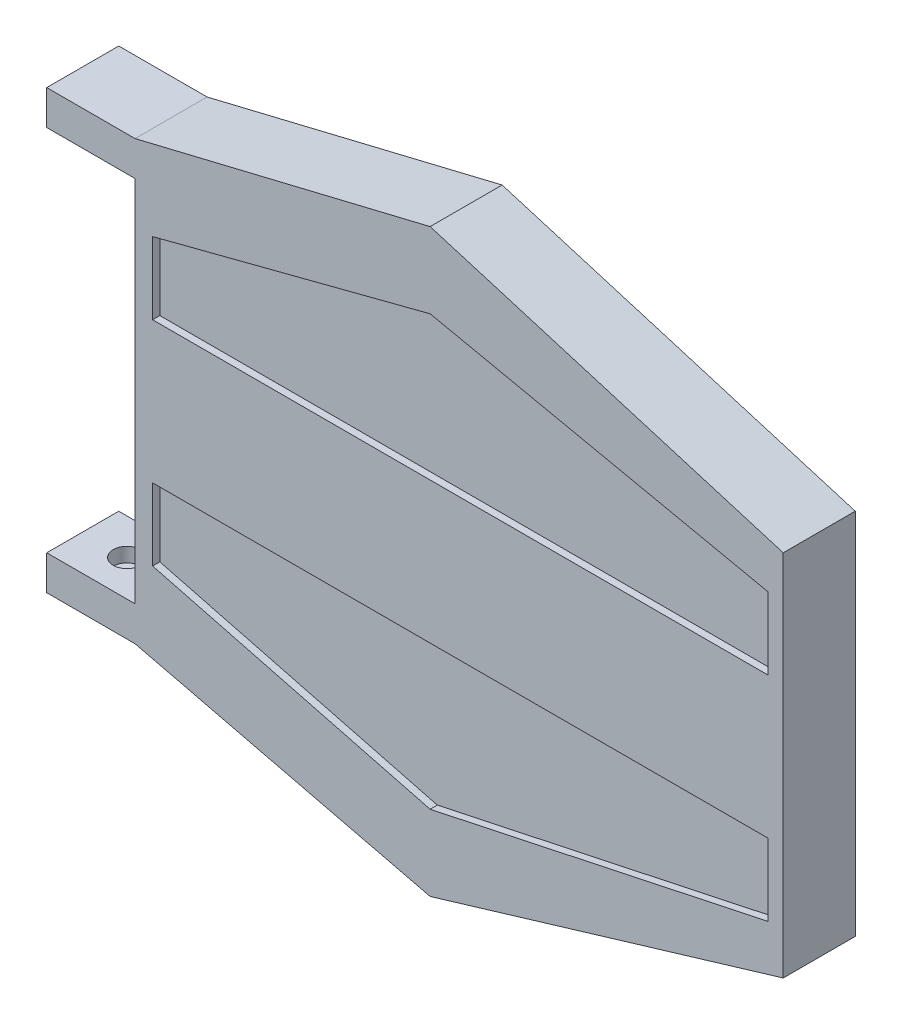
ISO-10303-21;
HEADER;
FILE_DESCRIPTION(('STEP AP214'),'2;1');
FILE_NAME('part.step','',(''),(''),'','','');
FILE_SCHEMA(('AUTOMOTIVE_DESIGN { 1 0 10303 214 1 1 1 1 }'));
ENDSEC;
DATA;
#1=APPLICATION_CONTEXT('core data for automotive mechanical design processes');
#2=APPLICATION_PROTOCOL_DEFINITION('international standard','automotive_design',2000,#1);
#3=PRODUCT_CONTEXT('',#1,'mechanical');
#4=PRODUCT('Part','Part','',(#3));
#5=PRODUCT_RELATED_PRODUCT_CATEGORY('part','',(#4));
#6=PRODUCT_DEFINITION_FORMATION('','',#4);
#7=PRODUCT_DEFINITION_CONTEXT('part definition',#1,'design');
#8=PRODUCT_DEFINITION('design','',#6,#7);
#9=PRODUCT_DEFINITION_SHAPE('','',#8);
#10=(LENGTH_UNIT() NAMED_UNIT(*) SI_UNIT(.MILLI.,.METRE.));
#11=(NAMED_UNIT(*) PLANE_ANGLE_UNIT() SI_UNIT($,.RADIAN.));
#12=(NAMED_UNIT(*) SI_UNIT($,.STERADIAN.) SOLID_ANGLE_UNIT());
#13=UNCERTAINTY_MEASURE_WITH_UNIT(LENGTH_MEASURE(1.E-05),#10,'distance_accuracy_value','');
#14=(GEOMETRIC_REPRESENTATION_CONTEXT(3) GLOBAL_UNCERTAINTY_ASSIGNED_CONTEXT((#13)) GLOBAL_UNIT_ASSIGNED_CONTEXT((#10,
#11,#12)) REPRESENTATION_CONTEXT('',''));
#15=CARTESIAN_POINT('',(0.,0.,0.));
#16=DIRECTION('',(0.,0.,1.));
#17=DIRECTION('',(1.,0.,0.));
#18=AXIS2_PLACEMENT_3D('',#15,#16,#17);
#19=CARTESIAN_POINT('',(-12.2750194552529,5.22355447470818,2.54));
#20=DIRECTION('',(0.,-1.,0.));
#21=DIRECTION('',(0.,0.,-1.));
#22=AXIS2_PLACEMENT_3D('',#19,#20,#21);
#23=PLANE('',#22);
#24=DIRECTION('',(-1.,0.,0.));
#25=VECTOR('',#24,1.);
#26=CARTESIAN_POINT('',(-12.2750194552529,5.22355447470818,0.));
#27=LINE('',#26,#25);
#28=CARTESIAN_POINT('',(-10.4070817120622,5.22355447470818,0.));
#29=VERTEX_POINT('',#28);
#30=CARTESIAN_POINT('',(-13.5203112840467,5.22355447470818,0.));
#31=VERTEX_POINT('',#30);
#32=EDGE_CURVE('E247',#29,#31,#27,.T.);
#33=ORIENTED_EDGE('',*,*,#32,.T.);
#34=DIRECTION('',(0.,0.,-1.));
#35=VECTOR('',#34,1.);
#36=CARTESIAN_POINT('',(-13.5203112840467,5.22355447470818,2.54));
#37=LINE('',#36,#35);
#38=CARTESIAN_POINT('',(-13.5203112840467,5.22355447470818,2.54));
#39=VERTEX_POINT('',#38);
#40=EDGE_CURVE('E11',#39,#31,#37,.T.);
#41=ORIENTED_EDGE('',*,*,#40,.F.);
#42=DIRECTION('',(-1.,0.,0.));
#43=VECTOR('',#42,1.);
#44=CARTESIAN_POINT('',(-12.2750194552529,5.22355447470818,2.54));
#45=LINE('',#44,#43);
#46=CARTESIAN_POINT('',(-10.4070817120622,5.22355447470818,2.54));
#47=VERTEX_POINT('',#46);
#48=EDGE_CURVE('E309',#47,#39,#45,.T.);
#49=ORIENTED_EDGE('',*,*,#48,.F.);
#50=DIRECTION('',(0.,0.,-1.));
#51=VECTOR('',#50,1.);
#52=CARTESIAN_POINT('',(-10.4070817120622,5.22355447470818,2.54));
#53=LINE('',#52,#51);
#54=EDGE_CURVE('E346',#47,#29,#53,.T.);
#55=ORIENTED_EDGE('',*,*,#54,.T.);
#56=EDGE_LOOP('',(#33,#41,#49,#55));
#57=FACE_BOUND('',#56,.T.);
#58=ADVANCED_FACE('F41',(#57),#23,.F.);
#59=CARTESIAN_POINT('',(-13.5203112840467,5.22355447470818,2.54));
#60=DIRECTION('',(1.,0.,0.));
#61=DIRECTION('',(0.,0.,-1.));
#62=AXIS2_PLACEMENT_3D('',#59,#60,#61);
#63=PLANE('',#62);
#64=DIRECTION('',(0.,-1.,0.));
#65=VECTOR('',#64,1.);
#66=CARTESIAN_POINT('',(-13.5203112840467,5.22355447470818,0.));
#67=LINE('',#66,#65);
#68=CARTESIAN_POINT('',(-13.5203112840467,4.00272373540856,0.));
#69=VERTEX_POINT('',#68);
#70=EDGE_CURVE('E349',#31,#69,#67,.T.);
#71=ORIENTED_EDGE('',*,*,#70,.T.);
#72=DIRECTION('',(0.,0.,-1.));
#73=VECTOR('',#72,1.);
#74=CARTESIAN_POINT('',(-13.5203112840467,4.00272373540856,2.54));
#75=LINE('',#74,#73);
#76=CARTESIAN_POINT('',(-13.5203112840467,4.00272373540856,2.54));
#77=VERTEX_POINT('',#76);
#78=EDGE_CURVE('E49',#77,#69,#75,.T.);
#79=ORIENTED_EDGE('',*,*,#78,.F.);
#80=DIRECTION('',(0.,-1.,0.));
#81=VECTOR('',#80,1.);
#82=CARTESIAN_POINT('',(-13.5203112840467,5.22355447470818,2.54));
#83=LINE('',#82,#81);
#84=EDGE_CURVE('E312',#39,#77,#83,.T.);
#85=ORIENTED_EDGE('',*,*,#84,.F.);
#86=ORIENTED_EDGE('',*,*,#40,.T.);
#87=EDGE_LOOP('',(#71,#79,#85,#86));
#88=FACE_BOUND('',#87,.T.);
#89=ADVANCED_FACE('F451',(#88),#63,.F.);
#90=CARTESIAN_POINT('',(-13.5203112840467,4.00272373540856,2.54));
#91=DIRECTION('',(0.,1.,0.));
#92=DIRECTION('',(0.,0.,1.));
#93=AXIS2_PLACEMENT_3D('',#90,#91,#92);
#94=PLANE('',#93);
#95=CARTESIAN_POINT('',(-11.9636964980545,4.00272373540856,1.27));
#96=DIRECTION('',(0.,-1.,0.));
#97=DIRECTION('',(0.,0.,-1.));
#98=AXIS2_PLACEMENT_3D('',#95,#96,#97);
#99=CIRCLE('',#98,0.508);
#100=CARTESIAN_POINT('',(-11.9636964980545,4.00272373540856,0.762));
#101=VERTEX_POINT('',#100);
#102=EDGE_CURVE('E520',#101,#101,#99,.T.);
#103=ORIENTED_EDGE('',*,*,#102,.F.);
#104=EDGE_LOOP('',(#103));
#105=FACE_BOUND('',#104,.T.);
#106=DIRECTION('',(1.,0.,0.));
#107=VECTOR('',#106,1.);
#108=CARTESIAN_POINT('',(-13.5203112840467,4.00272373540856,0.));
#109=LINE('',#108,#107);
#110=CARTESIAN_POINT('',(-10.4070817120622,4.00272373540856,0.));
#111=VERTEX_POINT('',#110);
#112=EDGE_CURVE('E352',#69,#111,#109,.T.);
#113=ORIENTED_EDGE('',*,*,#112,.T.);
#114=DIRECTION('',(0.,0.,-1.));
#115=VECTOR('',#114,1.);
#116=CARTESIAN_POINT('',(-10.4070817120622,4.00272373540856,2.54));
#117=LINE('',#116,#115);
#118=CARTESIAN_POINT('',(-10.4070817120622,4.00272373540856,2.54));
#119=VERTEX_POINT('',#118);
#120=EDGE_CURVE('E418',#119,#111,#117,.T.);
#121=ORIENTED_EDGE('',*,*,#120,.F.);
#122=DIRECTION('',(1.,0.,0.));
#123=VECTOR('',#122,1.);
#124=CARTESIAN_POINT('',(-13.5203112840467,4.00272373540856,2.54));
#125=LINE('',#124,#123);
#126=EDGE_CURVE('E316',#77,#119,#125,.T.);
#127=ORIENTED_EDGE('',*,*,#126,.F.);
#128=ORIENTED_EDGE('',*,*,#78,.T.);
#129=EDGE_LOOP('',(#113,#121,#127,#128));
#130=FACE_BOUND('',#129,.T.);
#131=ADVANCED_FACE('F427',(#105,#130),#94,.F.);
#132=CARTESIAN_POINT('',(-10.4070817120622,4.00272373540856,2.54));
#133=DIRECTION('',(1.,0.,0.));
#134=DIRECTION('',(0.,0.,-1.));
#135=AXIS2_PLACEMENT_3D('',#132,#133,#134);
#136=PLANE('',#135);
#137=DIRECTION('',(0.,-1.,0.));
#138=VECTOR('',#137,1.);
#139=CARTESIAN_POINT('',(-10.4070817120622,4.00272373540856,0.));
#140=LINE('',#139,#138);
#141=CARTESIAN_POINT('',(-10.4070817120622,-8.98389105058366,0.));
#142=VERTEX_POINT('',#141);
#143=EDGE_CURVE('E355',#111,#142,#140,.T.);
#144=ORIENTED_EDGE('',*,*,#143,.T.);
#145=DIRECTION('',(0.,0.,-1.));
#146=VECTOR('',#145,1.);
#147=CARTESIAN_POINT('',(-10.4070817120622,-8.98389105058366,2.54));
#148=LINE('',#147,#146);
#149=CARTESIAN_POINT('',(-10.4070817120622,-8.98389105058366,2.54));
#150=VERTEX_POINT('',#149);
#151=EDGE_CURVE('E414',#150,#142,#148,.T.);
#152=ORIENTED_EDGE('',*,*,#151,.F.);
#153=DIRECTION('',(0.,-1.,0.));
#154=VECTOR('',#153,1.);
#155=CARTESIAN_POINT('',(-10.4070817120622,4.00272373540856,2.54));
#156=LINE('',#155,#154);
#157=EDGE_CURVE('E319',#119,#150,#156,.T.);
#158=ORIENTED_EDGE('',*,*,#157,.F.);
#159=ORIENTED_EDGE('',*,*,#120,.T.);
#160=EDGE_LOOP('',(#144,#152,#158,#159));
#161=FACE_BOUND('',#160,.T.);
#162=ADVANCED_FACE('F439',(#161),#136,.F.);
#163=CARTESIAN_POINT('',(-13.5203112840467,-8.98389105058366,2.54));
#164=DIRECTION('',(0.,-1.,0.));
#165=DIRECTION('',(0.,0.,-1.));
#166=AXIS2_PLACEMENT_3D('',#163,#164,#165);
#167=PLANE('',#166);
#168=CARTESIAN_POINT('',(-11.9636964980545,-8.98389105058366,1.27));
#169=DIRECTION('',(0.,1.,0.));
#170=DIRECTION('',(0.,0.,1.));
#171=AXIS2_PLACEMENT_3D('',#168,#169,#170);
#172=CIRCLE('',#171,0.482014482903084);
#173=CARTESIAN_POINT('',(-11.9636964980545,-8.98389105058366,1.75201448290308));
#174=VERTEX_POINT('',#173);
#175=EDGE_CURVE('E221',#174,#174,#172,.T.);
#176=ORIENTED_EDGE('',*,*,#175,.F.);
#177=EDGE_LOOP('',(#176));
#178=FACE_BOUND('',#177,.T.);
#179=DIRECTION('',(-1.,0.,0.));
#180=VECTOR('',#179,1.);
#181=CARTESIAN_POINT('',(-13.5203112840467,-8.98389105058366,0.));
#182=LINE('',#181,#180);
#183=CARTESIAN_POINT('',(-13.5203112840467,-8.98389105058366,0.));
#184=VERTEX_POINT('',#183);
#185=EDGE_CURVE('E358',#142,#184,#182,.T.);
#186=ORIENTED_EDGE('',*,*,#185,.T.);
#187=DIRECTION('',(0.,0.,-1.));
#188=VECTOR('',#187,1.);
#189=CARTESIAN_POINT('',(-13.5203112840467,-8.98389105058366,2.54));
#190=LINE('',#189,#188);
#191=CARTESIAN_POINT('',(-13.5203112840467,-8.98389105058366,2.54));
#192=VERTEX_POINT('',#191);
#193=EDGE_CURVE('E410',#192,#184,#190,.T.);
#194=ORIENTED_EDGE('',*,*,#193,.F.);
#195=DIRECTION('',(-1.,0.,0.));
#196=VECTOR('',#195,1.);
#197=CARTESIAN_POINT('',(-13.5203112840467,-8.98389105058366,2.54));
#198=LINE('',#197,#196);
#199=EDGE_CURVE('E322',#150,#192,#198,.T.);
#200=ORIENTED_EDGE('',*,*,#199,.F.);
#201=ORIENTED_EDGE('',*,*,#151,.T.);
#202=EDGE_LOOP('',(#186,#194,#200,#201));
#203=FACE_BOUND('',#202,.T.);
#204=ADVANCED_FACE('F443',(#178,#203),#167,.F.);
#205=CARTESIAN_POINT('',(-13.5203112840467,-10.2047217898833,2.54));
#206=DIRECTION('',(1.,0.,0.));
#207=DIRECTION('',(0.,0.,-1.));
#208=AXIS2_PLACEMENT_3D('',#205,#206,#207);
#209=PLANE('',#208);
#210=DIRECTION('',(0.,-1.,0.));
#211=VECTOR('',#210,1.);
#212=CARTESIAN_POINT('',(-13.5203112840467,-10.2047217898833,0.));
#213=LINE('',#212,#211);
#214=CARTESIAN_POINT('',(-13.5203112840467,-10.2047217898833,0.));
#215=VERTEX_POINT('',#214);
#216=EDGE_CURVE('E361',#184,#215,#213,.T.);
#217=ORIENTED_EDGE('',*,*,#216,.T.);
#218=DIRECTION('',(0.,0.,-1.));
#219=VECTOR('',#218,1.);
#220=CARTESIAN_POINT('',(-13.5203112840467,-10.2047217898833,2.54));
#221=LINE('',#220,#219);
#222=CARTESIAN_POINT('',(-13.5203112840467,-10.2047217898833,2.54));
#223=VERTEX_POINT('',#222);
#224=EDGE_CURVE('E406',#223,#215,#221,.T.);
#225=ORIENTED_EDGE('',*,*,#224,.F.);
#226=DIRECTION('',(0.,-1.,0.));
#227=VECTOR('',#226,1.);
#228=CARTESIAN_POINT('',(-13.5203112840467,-10.2047217898833,2.54));
#229=LINE('',#228,#227);
#230=EDGE_CURVE('E325',#192,#223,#229,.T.);
#231=ORIENTED_EDGE('',*,*,#230,.F.);
#232=ORIENTED_EDGE('',*,*,#193,.T.);
#233=EDGE_LOOP('',(#217,#225,#231,#232));
#234=FACE_BOUND('',#233,.T.);
#235=ADVANCED_FACE('F481',(#234),#209,.F.);
#236=CARTESIAN_POINT('',(-12.2750194552529,-10.2047217898833,2.54));
#237=DIRECTION('',(0.,1.,0.));
#238=DIRECTION('',(0.,0.,1.));
#239=AXIS2_PLACEMENT_3D('',#236,#237,#238);
#240=PLANE('',#239);
#241=DIRECTION('',(1.,0.,0.));
#242=VECTOR('',#241,1.);
#243=CARTESIAN_POINT('',(-12.2750194552529,-10.2047217898833,0.));
#244=LINE('',#243,#242);
#245=CARTESIAN_POINT('',(-10.4070817120622,-10.2047217898833,0.));
#246=VERTEX_POINT('',#245);
#247=EDGE_CURVE('E365',#215,#246,#244,.T.);
#248=ORIENTED_EDGE('',*,*,#247,.T.);
#249=DIRECTION('',(0.,0.,-1.));
#250=VECTOR('',#249,1.);
#251=CARTESIAN_POINT('',(-10.4070817120622,-10.2047217898833,2.54));
#252=LINE('',#251,#250);
#253=CARTESIAN_POINT('',(-10.4070817120622,-10.2047217898833,2.54));
#254=VERTEX_POINT('',#253);
#255=EDGE_CURVE('E402',#254,#246,#252,.T.);
#256=ORIENTED_EDGE('',*,*,#255,.F.);
#257=DIRECTION('',(1.,0.,0.));
#258=VECTOR('',#257,1.);
#259=CARTESIAN_POINT('',(-12.2750194552529,-10.2047217898833,2.54));
#260=LINE('',#259,#258);
#261=EDGE_CURVE('E328',#223,#254,#260,.T.);
#262=ORIENTED_EDGE('',*,*,#261,.F.);
#263=ORIENTED_EDGE('',*,*,#224,.T.);
#264=EDGE_LOOP('',(#248,#256,#262,#263));
#265=FACE_BOUND('',#264,.T.);
#266=ADVANCED_FACE('F483',(#265),#240,.F.);
#267=CARTESIAN_POINT('',(-10.4070817120622,-10.2047217898833,2.54));
#268=DIRECTION('',(0.234904462052635,0.972018463666078,0.));
#269=DIRECTION('',(-0.972018463666078,0.234904462052635,0.));
#270=AXIS2_PLACEMENT_3D('',#267,#268,#269);
#271=PLANE('',#270);
#272=DIRECTION('',(0.972018463666078,-0.234904462052635,0.));
#273=VECTOR('',#272,1.);
#274=CARTESIAN_POINT('',(-10.4070817120622,-10.2047217898833,0.));
#275=LINE('',#274,#273);
#276=CARTESIAN_POINT('',(0.,-12.719766536965,0.));
#277=VERTEX_POINT('',#276);
#278=EDGE_CURVE('E368',#246,#277,#275,.T.);
#279=ORIENTED_EDGE('',*,*,#278,.T.);
#280=DIRECTION('',(0.,0.,-1.));
#281=VECTOR('',#280,1.);
#282=CARTESIAN_POINT('',(0.,-12.719766536965,2.54));
#283=LINE('',#282,#281);
#284=CARTESIAN_POINT('',(0.,-12.719766536965,2.54));
#285=VERTEX_POINT('',#284);
#286=EDGE_CURVE('E398',#285,#277,#283,.T.);
#287=ORIENTED_EDGE('',*,*,#286,.F.);
#288=DIRECTION('',(0.972018463666078,-0.234904462052635,0.));
#289=VECTOR('',#288,1.);
#290=CARTESIAN_POINT('',(-10.4070817120622,-10.2047217898833,2.54));
#291=LINE('',#290,#289);
#292=EDGE_CURVE('E331',#254,#285,#291,.T.);
#293=ORIENTED_EDGE('',*,*,#292,.F.);
#294=ORIENTED_EDGE('',*,*,#255,.T.);
#295=EDGE_LOOP('',(#279,#287,#293,#294));
#296=FACE_BOUND('',#295,.T.);
#297=ADVANCED_FACE('F477',(#296),#271,.F.);
#298=CARTESIAN_POINT('',(0.,-12.719766536965,2.54));
#299=DIRECTION('',(-0.287347885566345,0.957826285221151,0.));
#300=DIRECTION('',(-0.957826285221152,-0.287347885566345,0.));
#301=AXIS2_PLACEMENT_3D('',#298,#299,#300);
#302=PLANE('',#301);
#303=DIRECTION('',(0.957826285221151,0.287347885566345,0.));
#304=VECTOR('',#303,1.);
#305=CARTESIAN_POINT('',(0.,-12.719766536965,0.));
#306=LINE('',#305,#304);
#307=CARTESIAN_POINT('',(12.4529182879378,-8.98389105058366,0.));
#308=VERTEX_POINT('',#307);
#309=EDGE_CURVE('E371',#277,#308,#306,.T.);
#310=ORIENTED_EDGE('',*,*,#309,.T.);
#311=DIRECTION('',(0.,0.,-1.));
#312=VECTOR('',#311,1.);
#313=CARTESIAN_POINT('',(12.4529182879378,-8.98389105058366,2.54));
#314=LINE('',#313,#312);
#315=CARTESIAN_POINT('',(12.4529182879378,-8.98389105058366,2.54));
#316=VERTEX_POINT('',#315);
#317=EDGE_CURVE('E394',#316,#308,#314,.T.);
#318=ORIENTED_EDGE('',*,*,#317,.F.);
#319=DIRECTION('',(0.957826285221151,0.287347885566345,0.));
#320=VECTOR('',#319,1.);
#321=CARTESIAN_POINT('',(0.,-12.719766536965,2.54));
#322=LINE('',#321,#320);
#323=EDGE_CURVE('E334',#285,#316,#322,.T.);
#324=ORIENTED_EDGE('',*,*,#323,.F.);
#325=ORIENTED_EDGE('',*,*,#286,.T.);
#326=EDGE_LOOP('',(#310,#318,#324,#325));
#327=FACE_BOUND('',#326,.T.);
#328=ADVANCED_FACE('F473',(#327),#302,.F.);
#329=CARTESIAN_POINT('',(12.4529182879378,-8.98389105058366,2.54));
#330=DIRECTION('',(-1.,0.,0.));
#331=DIRECTION('',(0.,0.,1.));
#332=AXIS2_PLACEMENT_3D('',#329,#330,#331);
#333=PLANE('',#332);
#334=DIRECTION('',(0.,1.,0.));
#335=VECTOR('',#334,1.);
#336=CARTESIAN_POINT('',(12.4529182879378,-8.98389105058366,0.));
#337=LINE('',#336,#335);
#338=CARTESIAN_POINT('',(12.4529182879378,4.00272373540856,0.));
#339=VERTEX_POINT('',#338);
#340=EDGE_CURVE('E374',#308,#339,#337,.T.);
#341=ORIENTED_EDGE('',*,*,#340,.T.);
#342=DIRECTION('',(0.,0.,-1.));
#343=VECTOR('',#342,1.);
#344=CARTESIAN_POINT('',(12.4529182879378,4.00272373540856,2.54));
#345=LINE('',#344,#343);
#346=CARTESIAN_POINT('',(12.4529182879378,4.00272373540856,2.54));
#347=VERTEX_POINT('',#346);
#348=EDGE_CURVE('E390',#347,#339,#345,.T.);
#349=ORIENTED_EDGE('',*,*,#348,.F.);
#350=DIRECTION('',(0.,1.,0.));
#351=VECTOR('',#350,1.);
#352=CARTESIAN_POINT('',(12.4529182879378,-8.98389105058366,2.54));
#353=LINE('',#352,#351);
#354=EDGE_CURVE('E337',#316,#347,#353,.T.);
#355=ORIENTED_EDGE('',*,*,#354,.F.);
#356=ORIENTED_EDGE('',*,*,#317,.T.);
#357=EDGE_LOOP('',(#341,#349,#355,#356));
#358=FACE_BOUND('',#357,.T.);
#359=ADVANCED_FACE('F468',(#358),#333,.F.);
#360=CARTESIAN_POINT('',(0.,7.73859922178988,2.54));
#361=DIRECTION('',(-0.287347885566345,-0.957826285221151,0.));
#362=DIRECTION('',(0.957826285221152,-0.287347885566345,0.));
#363=AXIS2_PLACEMENT_3D('',#360,#361,#362);
#364=PLANE('',#363);
#365=DIRECTION('',(-0.957826285221151,0.287347885566345,0.));
#366=VECTOR('',#365,1.);
#367=CARTESIAN_POINT('',(0.,7.73859922178988,0.));
#368=LINE('',#367,#366);
#369=CARTESIAN_POINT('',(0.,7.73859922178988,0.));
#370=VERTEX_POINT('',#369);
#371=EDGE_CURVE('E377',#339,#370,#368,.T.);
#372=ORIENTED_EDGE('',*,*,#371,.T.);
#373=DIRECTION('',(0.,0.,-1.));
#374=VECTOR('',#373,1.);
#375=CARTESIAN_POINT('',(0.,7.73859922178988,2.54));
#376=LINE('',#375,#374);
#377=CARTESIAN_POINT('',(0.,7.73859922178988,2.54));
#378=VERTEX_POINT('',#377);
#379=EDGE_CURVE('E386',#378,#370,#376,.T.);
#380=ORIENTED_EDGE('',*,*,#379,.F.);
#381=DIRECTION('',(-0.957826285221151,0.287347885566345,0.));
#382=VECTOR('',#381,1.);
#383=CARTESIAN_POINT('',(0.,7.73859922178988,2.54));
#384=LINE('',#383,#382);
#385=EDGE_CURVE('E340',#347,#378,#384,.T.);
#386=ORIENTED_EDGE('',*,*,#385,.F.);
#387=ORIENTED_EDGE('',*,*,#348,.T.);
#388=EDGE_LOOP('',(#372,#380,#386,#387));
#389=FACE_BOUND('',#388,.T.);
#390=ADVANCED_FACE('F462',(#389),#364,.F.);
#391=CARTESIAN_POINT('',(-10.4070817120622,5.22355447470818,2.54));
#392=DIRECTION('',(0.234904462052635,-0.972018463666078,0.));
#393=DIRECTION('',(0.972018463666078,0.234904462052635,0.));
#394=AXIS2_PLACEMENT_3D('',#391,#392,#393);
#395=PLANE('',#394);
#396=DIRECTION('',(-0.972018463666078,-0.234904462052635,0.));
#397=VECTOR('',#396,1.);
#398=CARTESIAN_POINT('',(-10.4070817120622,5.22355447470818,0.));
#399=LINE('',#398,#397);
#400=EDGE_CURVE('E313',#370,#29,#399,.T.);
#401=ORIENTED_EDGE('',*,*,#400,.T.);
#402=ORIENTED_EDGE('',*,*,#54,.F.);
#403=DIRECTION('',(-0.972018463666078,-0.234904462052635,0.));
#404=VECTOR('',#403,1.);
#405=CARTESIAN_POINT('',(-10.4070817120622,5.22355447470818,2.54));
#406=LINE('',#405,#404);
#407=EDGE_CURVE('E343',#378,#47,#406,.T.);
#408=ORIENTED_EDGE('',*,*,#407,.F.);
#409=ORIENTED_EDGE('',*,*,#379,.T.);
#410=EDGE_LOOP('',(#401,#402,#408,#409));
#411=FACE_BOUND('',#410,.T.);
#412=ADVANCED_FACE('F457',(#411),#395,.F.);
#413=CARTESIAN_POINT('',(0.,0.,2.54));
#414=DIRECTION('',(0.,0.,1.));
#415=DIRECTION('',(1.,0.,0.));
#416=AXIS2_PLACEMENT_3D('',#413,#414,#415);
#417=PLANE('',#416);
#418=DIRECTION('',(0.,-1.,0.));
#419=VECTOR('',#418,1.);
#420=CARTESIAN_POINT('',(-9.78623867969475,2.54,2.54));
#421=LINE('',#420,#419);
#422=CARTESIAN_POINT('',(-9.78623867969475,2.54,2.54));
#423=VERTEX_POINT('',#422);
#424=CARTESIAN_POINT('',(-9.78623867969475,0.,2.54));
#425=VERTEX_POINT('',#424);
#426=EDGE_CURVE('E56',#423,#425,#421,.T.);
#427=ORIENTED_EDGE('',*,*,#426,.F.);
#428=DIRECTION('',(-0.968036286332692,-0.250810183890549,0.));
#429=VECTOR('',#428,1.);
#430=CARTESIAN_POINT('',(0.,5.07553338599488,2.54));
#431=LINE('',#430,#429);
#432=CARTESIAN_POINT('',(0.,5.07553338599488,2.54));
#433=VERTEX_POINT('',#432);
#434=EDGE_CURVE('E214',#433,#423,#431,.T.);
#435=ORIENTED_EDGE('',*,*,#434,.F.);
#436=DIRECTION('',(-0.978127996740761,0.208003898982462,0.));
#437=VECTOR('',#436,1.);
#438=CARTESIAN_POINT('',(11.9232197263841,2.54,2.54));
#439=LINE('',#438,#437);
#440=CARTESIAN_POINT('',(11.9232197263841,2.54,2.54));
#441=VERTEX_POINT('',#440);
#442=EDGE_CURVE('E218',#441,#433,#439,.T.);
#443=ORIENTED_EDGE('',*,*,#442,.F.);
#444=DIRECTION('',(0.,1.,0.));
#445=VECTOR('',#444,1.);
#446=CARTESIAN_POINT('',(11.9232197263841,0.,2.54));
#447=LINE('',#446,#445);
#448=CARTESIAN_POINT('',(11.9232197263841,0.,2.54));
#449=VERTEX_POINT('',#448);
#450=EDGE_CURVE('E237',#449,#441,#447,.T.);
#451=ORIENTED_EDGE('',*,*,#450,.F.);
#452=DIRECTION('',(1.,0.,0.));
#453=VECTOR('',#452,1.);
#454=CARTESIAN_POINT('',(-9.78623867969475,0.,2.54));
#455=LINE('',#454,#453);
#456=EDGE_CURVE('E233',#425,#449,#455,.T.);
#457=ORIENTED_EDGE('',*,*,#456,.F.);
#458=EDGE_LOOP('',(#427,#435,#443,#451,#457));
#459=FACE_BOUND('',#458,.T.);
#460=DIRECTION('',(0.978127996740761,0.208003898982462,0.));
#461=VECTOR('',#460,1.);
#462=CARTESIAN_POINT('',(11.9232197263841,-7.5211673151751,2.54));
#463=LINE('',#462,#461);
#464=CARTESIAN_POINT('',(0.,-10.05670070117,2.54));
#465=VERTEX_POINT('',#464);
#466=CARTESIAN_POINT('',(11.9232197263841,-7.5211673151751,2.54));
#467=VERTEX_POINT('',#466);
#468=EDGE_CURVE('E64',#465,#467,#463,.T.);
#469=ORIENTED_EDGE('',*,*,#468,.F.);
#470=DIRECTION('',(0.968036286332692,-0.250810183890549,0.));
#471=VECTOR('',#470,1.);
#472=CARTESIAN_POINT('',(0.,-10.05670070117,2.54));
#473=LINE('',#472,#471);
#474=CARTESIAN_POINT('',(-9.78623867969475,-7.5211673151751,2.54));
#475=VERTEX_POINT('',#474);
#476=EDGE_CURVE('E261',#475,#465,#473,.T.);
#477=ORIENTED_EDGE('',*,*,#476,.F.);
#478=DIRECTION('',(0.,-1.,0.));
#479=VECTOR('',#478,1.);
#480=CARTESIAN_POINT('',(-9.78623867969475,-7.5211673151751,2.54));
#481=LINE('',#480,#479);
#482=CARTESIAN_POINT('',(-9.78623867969475,-4.9811673151751,2.54));
#483=VERTEX_POINT('',#482);
#484=EDGE_CURVE('E289',#483,#475,#481,.T.);
#485=ORIENTED_EDGE('',*,*,#484,.F.);
#486=DIRECTION('',(-1.,0.,0.));
#487=VECTOR('',#486,1.);
#488=CARTESIAN_POINT('',(-9.78623867969475,-4.9811673151751,2.54));
#489=LINE('',#488,#487);
#490=CARTESIAN_POINT('',(11.9232197263841,-4.9811673151751,2.54));
#491=VERTEX_POINT('',#490);
#492=EDGE_CURVE('E285',#491,#483,#489,.T.);
#493=ORIENTED_EDGE('',*,*,#492,.F.);
#494=DIRECTION('',(0.,1.,0.));
#495=VECTOR('',#494,1.);
#496=CARTESIAN_POINT('',(11.9232197263841,-4.9811673151751,2.54));
#497=LINE('',#496,#495);
#498=EDGE_CURVE('E280',#467,#491,#497,.T.);
#499=ORIENTED_EDGE('',*,*,#498,.F.);
#500=EDGE_LOOP('',(#469,#477,#485,#493,#499));
#501=FACE_BOUND('',#500,.T.);
#502=ORIENTED_EDGE('',*,*,#48,.T.);
#503=ORIENTED_EDGE('',*,*,#84,.T.);
#504=ORIENTED_EDGE('',*,*,#126,.T.);
#505=ORIENTED_EDGE('',*,*,#157,.T.);
#506=ORIENTED_EDGE('',*,*,#199,.T.);
#507=ORIENTED_EDGE('',*,*,#230,.T.);
#508=ORIENTED_EDGE('',*,*,#261,.T.);
#509=ORIENTED_EDGE('',*,*,#292,.T.);
#510=ORIENTED_EDGE('',*,*,#323,.T.);
#511=ORIENTED_EDGE('',*,*,#354,.T.);
#512=ORIENTED_EDGE('',*,*,#385,.T.);
#513=ORIENTED_EDGE('',*,*,#407,.T.);
#514=EDGE_LOOP('',(#502,#503,#504,#505,#506,#507,#508,#509,#510,#511,#512,#513));
#515=FACE_BOUND('',#514,.T.);
#516=ADVANCED_FACE('F447',(#459,#501,#515),#417,.T.);
#517=CARTESIAN_POINT('',(0.,0.,0.));
#518=DIRECTION('',(0.,0.,1.));
#519=DIRECTION('',(1.,0.,0.));
#520=AXIS2_PLACEMENT_3D('',#517,#518,#519);
#521=PLANE('',#520);
#522=ORIENTED_EDGE('',*,*,#32,.F.);
#523=ORIENTED_EDGE('',*,*,#400,.F.);
#524=ORIENTED_EDGE('',*,*,#371,.F.);
#525=ORIENTED_EDGE('',*,*,#340,.F.);
#526=ORIENTED_EDGE('',*,*,#309,.F.);
#527=ORIENTED_EDGE('',*,*,#278,.F.);
#528=ORIENTED_EDGE('',*,*,#247,.F.);
#529=ORIENTED_EDGE('',*,*,#216,.F.);
#530=ORIENTED_EDGE('',*,*,#185,.F.);
#531=ORIENTED_EDGE('',*,*,#143,.F.);
#532=ORIENTED_EDGE('',*,*,#112,.F.);
#533=ORIENTED_EDGE('',*,*,#70,.F.);
#534=EDGE_LOOP('',(#522,#523,#524,#525,#526,#527,#528,#529,#530,#531,#532,#533));
#535=FACE_BOUND('',#534,.T.);
#536=ADVANCED_FACE('F434',(#535),#521,.F.);
#537=CARTESIAN_POINT('',(11.9232197263841,-7.5211673151751,2.286));
#538=DIRECTION('',(0.208003898982462,-0.978127996740761,0.));
#539=DIRECTION('',(0.978127996740761,0.208003898982462,0.));
#540=AXIS2_PLACEMENT_3D('',#537,#538,#539);
#541=PLANE('',#540);
#542=ORIENTED_EDGE('',*,*,#468,.T.);
#543=DIRECTION('',(0.,0.,1.));
#544=VECTOR('',#543,1.);
#545=CARTESIAN_POINT('',(11.9232197263841,-7.5211673151751,2.286));
#546=LINE('',#545,#544);
#547=CARTESIAN_POINT('',(11.9232197263841,-7.5211673151751,2.286));
#548=VERTEX_POINT('',#547);
#549=EDGE_CURVE('E277',#548,#467,#546,.T.);
#550=ORIENTED_EDGE('',*,*,#549,.F.);
#551=DIRECTION('',(0.978127996740761,0.208003898982462,0.));
#552=VECTOR('',#551,1.);
#553=CARTESIAN_POINT('',(11.9232197263841,-7.5211673151751,2.286));
#554=LINE('',#553,#552);
#555=CARTESIAN_POINT('',(0.,-10.05670070117,2.286));
#556=VERTEX_POINT('',#555);
#557=EDGE_CURVE('E256',#556,#548,#554,.T.);
#558=ORIENTED_EDGE('',*,*,#557,.F.);
#559=DIRECTION('',(0.,0.,1.));
#560=VECTOR('',#559,1.);
#561=CARTESIAN_POINT('',(0.,-10.05670070117,2.286));
#562=LINE('',#561,#560);
#563=EDGE_CURVE('E234',#556,#465,#562,.T.);
#564=ORIENTED_EDGE('',*,*,#563,.T.);
#565=EDGE_LOOP('',(#542,#550,#558,#564));
#566=FACE_BOUND('',#565,.T.);
#567=ADVANCED_FACE('F574',(#566),#541,.F.);
#568=CARTESIAN_POINT('',(0.,-10.05670070117,2.286));
#569=DIRECTION('',(-0.250810183890549,-0.968036286332692,0.));
#570=DIRECTION('',(0.968036286332692,-0.250810183890549,0.));
#571=AXIS2_PLACEMENT_3D('',#568,#569,#570);
#572=PLANE('',#571);
#573=ORIENTED_EDGE('',*,*,#476,.T.);
#574=ORIENTED_EDGE('',*,*,#563,.F.);
#575=DIRECTION('',(0.968036286332692,-0.250810183890549,0.));
#576=VECTOR('',#575,1.);
#577=CARTESIAN_POINT('',(0.,-10.05670070117,2.286));
#578=LINE('',#577,#576);
#579=CARTESIAN_POINT('',(-9.78623867969475,-7.5211673151751,2.286));
#580=VERTEX_POINT('',#579);
#581=EDGE_CURVE('E273',#580,#556,#578,.T.);
#582=ORIENTED_EDGE('',*,*,#581,.F.);
#583=DIRECTION('',(0.,0.,1.));
#584=VECTOR('',#583,1.);
#585=CARTESIAN_POINT('',(-9.78623867969475,-7.5211673151751,2.286));
#586=LINE('',#585,#584);
#587=EDGE_CURVE('E298',#580,#475,#586,.T.);
#588=ORIENTED_EDGE('',*,*,#587,.T.);
#589=EDGE_LOOP('',(#573,#574,#582,#588));
#590=FACE_BOUND('',#589,.T.);
#591=ADVANCED_FACE('F570',(#590),#572,.F.);
#592=CARTESIAN_POINT('',(-9.78623867969475,-7.5211673151751,2.286));
#593=DIRECTION('',(-1.,0.,0.));
#594=DIRECTION('',(0.,0.,1.));
#595=AXIS2_PLACEMENT_3D('',#592,#593,#594);
#596=PLANE('',#595);
#597=ORIENTED_EDGE('',*,*,#484,.T.);
#598=ORIENTED_EDGE('',*,*,#587,.F.);
#599=DIRECTION('',(0.,-1.,0.));
#600=VECTOR('',#599,1.);
#601=CARTESIAN_POINT('',(-9.78623867969475,-7.5211673151751,2.286));
#602=LINE('',#601,#600);
#603=CARTESIAN_POINT('',(-9.78623867969475,-4.9811673151751,2.286));
#604=VERTEX_POINT('',#603);
#605=EDGE_CURVE('E269',#604,#580,#602,.T.);
#606=ORIENTED_EDGE('',*,*,#605,.F.);
#607=DIRECTION('',(0.,0.,1.));
#608=VECTOR('',#607,1.);
#609=CARTESIAN_POINT('',(-9.78623867969475,-4.9811673151751,2.286));
#610=LINE('',#609,#608);
#611=EDGE_CURVE('E301',#604,#483,#610,.T.);
#612=ORIENTED_EDGE('',*,*,#611,.T.);
#613=EDGE_LOOP('',(#597,#598,#606,#612));
#614=FACE_BOUND('',#613,.T.);
#615=ADVANCED_FACE('F573',(#614),#596,.F.);
#616=CARTESIAN_POINT('',(-9.78623867969475,-4.9811673151751,2.286));
#617=DIRECTION('',(0.,1.,0.));
#618=DIRECTION('',(0.,0.,1.));
#619=AXIS2_PLACEMENT_3D('',#616,#617,#618);
#620=PLANE('',#619);
#621=ORIENTED_EDGE('',*,*,#492,.T.);
#622=ORIENTED_EDGE('',*,*,#611,.F.);
#623=DIRECTION('',(-1.,0.,0.));
#624=VECTOR('',#623,1.);
#625=CARTESIAN_POINT('',(-9.78623867969475,-4.9811673151751,2.286));
#626=LINE('',#625,#624);
#627=CARTESIAN_POINT('',(11.9232197263841,-4.9811673151751,2.286));
#628=VERTEX_POINT('',#627);
#629=EDGE_CURVE('E265',#628,#604,#626,.T.);
#630=ORIENTED_EDGE('',*,*,#629,.F.);
#631=DIRECTION('',(0.,0.,1.));
#632=VECTOR('',#631,1.);
#633=CARTESIAN_POINT('',(11.9232197263841,-4.9811673151751,2.286));
#634=LINE('',#633,#632);
#635=EDGE_CURVE('E304',#628,#491,#634,.T.);
#636=ORIENTED_EDGE('',*,*,#635,.T.);
#637=EDGE_LOOP('',(#621,#622,#630,#636));
#638=FACE_BOUND('',#637,.T.);
#639=ADVANCED_FACE('F578',(#638),#620,.F.);
#640=CARTESIAN_POINT('',(11.9232197263841,-4.9811673151751,2.286));
#641=DIRECTION('',(1.,0.,0.));
#642=DIRECTION('',(0.,0.,-1.));
#643=AXIS2_PLACEMENT_3D('',#640,#641,#642);
#644=PLANE('',#643);
#645=ORIENTED_EDGE('',*,*,#498,.T.);
#646=ORIENTED_EDGE('',*,*,#635,.F.);
#647=DIRECTION('',(0.,1.,0.));
#648=VECTOR('',#647,1.);
#649=CARTESIAN_POINT('',(11.9232197263841,-4.9811673151751,2.286));
#650=LINE('',#649,#648);
#651=EDGE_CURVE('E260',#548,#628,#650,.T.);
#652=ORIENTED_EDGE('',*,*,#651,.F.);
#653=ORIENTED_EDGE('',*,*,#549,.T.);
#654=EDGE_LOOP('',(#645,#646,#652,#653));
#655=FACE_BOUND('',#654,.T.);
#656=ADVANCED_FACE('F568',(#655),#644,.F.);
#657=CARTESIAN_POINT('',(0.,0.,2.286));
#658=DIRECTION('',(0.,0.,-1.));
#659=DIRECTION('',(-1.,0.,0.));
#660=AXIS2_PLACEMENT_3D('',#657,#658,#659);
#661=PLANE('',#660);
#662=ORIENTED_EDGE('',*,*,#557,.T.);
#663=ORIENTED_EDGE('',*,*,#651,.T.);
#664=ORIENTED_EDGE('',*,*,#629,.T.);
#665=ORIENTED_EDGE('',*,*,#605,.T.);
#666=ORIENTED_EDGE('',*,*,#581,.T.);
#667=EDGE_LOOP('',(#662,#663,#664,#665,#666));
#668=FACE_BOUND('',#667,.T.);
#669=ADVANCED_FACE('F565',(#668),#661,.F.);
#670=CARTESIAN_POINT('',(-9.78623867969475,2.54,2.286));
#671=DIRECTION('',(-1.,0.,0.));
#672=DIRECTION('',(0.,0.,1.));
#673=AXIS2_PLACEMENT_3D('',#670,#671,#672);
#674=PLANE('',#673);
#675=ORIENTED_EDGE('',*,*,#426,.T.);
#676=DIRECTION('',(0.,0.,1.));
#677=VECTOR('',#676,1.);
#678=CARTESIAN_POINT('',(-9.78623867969475,0.,2.286));
#679=LINE('',#678,#677);
#680=CARTESIAN_POINT('',(-9.78623867969475,0.,2.286));
#681=VERTEX_POINT('',#680);
#682=EDGE_CURVE('E188',#681,#425,#679,.T.);
#683=ORIENTED_EDGE('',*,*,#682,.F.);
#684=DIRECTION('',(0.,-1.,0.));
#685=VECTOR('',#684,1.);
#686=CARTESIAN_POINT('',(-9.78623867969475,2.54,2.286));
#687=LINE('',#686,#685);
#688=CARTESIAN_POINT('',(-9.78623867969475,2.54,2.286));
#689=VERTEX_POINT('',#688);
#690=EDGE_CURVE('E192',#689,#681,#687,.T.);
#691=ORIENTED_EDGE('',*,*,#690,.F.);
#692=DIRECTION('',(0.,0.,1.));
#693=VECTOR('',#692,1.);
#694=CARTESIAN_POINT('',(-9.78623867969475,2.54,2.286));
#695=LINE('',#694,#693);
#696=EDGE_CURVE('E244',#689,#423,#695,.T.);
#697=ORIENTED_EDGE('',*,*,#696,.T.);
#698=EDGE_LOOP('',(#675,#683,#691,#697));
#699=FACE_BOUND('',#698,.T.);
#700=ADVANCED_FACE('F190',(#699),#674,.F.);
#701=CARTESIAN_POINT('',(0.,5.07553338599488,2.286));
#702=DIRECTION('',(-0.250810183890549,0.968036286332692,0.));
#703=DIRECTION('',(-0.968036286332692,-0.250810183890549,0.));
#704=AXIS2_PLACEMENT_3D('',#701,#702,#703);
#705=PLANE('',#704);
#706=ORIENTED_EDGE('',*,*,#434,.T.);
#707=ORIENTED_EDGE('',*,*,#696,.F.);
#708=DIRECTION('',(-0.968036286332692,-0.250810183890549,0.));
#709=VECTOR('',#708,1.);
#710=CARTESIAN_POINT('',(0.,5.07553338599488,2.286));
#711=LINE('',#710,#709);
#712=CARTESIAN_POINT('',(0.,5.07553338599488,2.286));
#713=VERTEX_POINT('',#712);
#714=EDGE_CURVE('E199',#713,#689,#711,.T.);
#715=ORIENTED_EDGE('',*,*,#714,.F.);
#716=DIRECTION('',(0.,0.,1.));
#717=VECTOR('',#716,1.);
#718=CARTESIAN_POINT('',(0.,5.07553338599488,2.286));
#719=LINE('',#718,#717);
#720=EDGE_CURVE('E248',#713,#433,#719,.T.);
#721=ORIENTED_EDGE('',*,*,#720,.T.);
#722=EDGE_LOOP('',(#706,#707,#715,#721));
#723=FACE_BOUND('',#722,.T.);
#724=ADVANCED_FACE('F549',(#723),#705,.F.);
#725=CARTESIAN_POINT('',(11.9232197263841,2.54,2.286));
#726=DIRECTION('',(0.208003898982462,0.978127996740761,0.));
#727=DIRECTION('',(-0.978127996740761,0.208003898982462,0.));
#728=AXIS2_PLACEMENT_3D('',#725,#726,#727);
#729=PLANE('',#728);
#730=ORIENTED_EDGE('',*,*,#442,.T.);
#731=ORIENTED_EDGE('',*,*,#720,.F.);
#732=DIRECTION('',(-0.978127996740761,0.208003898982462,0.));
#733=VECTOR('',#732,1.);
#734=CARTESIAN_POINT('',(11.9232197263841,2.54,2.286));
#735=LINE('',#734,#733);
#736=CARTESIAN_POINT('',(11.9232197263841,2.54,2.286));
#737=VERTEX_POINT('',#736);
#738=EDGE_CURVE('E226',#737,#713,#735,.T.);
#739=ORIENTED_EDGE('',*,*,#738,.F.);
#740=DIRECTION('',(0.,0.,1.));
#741=VECTOR('',#740,1.);
#742=CARTESIAN_POINT('',(11.9232197263841,2.54,2.286));
#743=LINE('',#742,#741);
#744=EDGE_CURVE('E251',#737,#441,#743,.T.);
#745=ORIENTED_EDGE('',*,*,#744,.T.);
#746=EDGE_LOOP('',(#730,#731,#739,#745));
#747=FACE_BOUND('',#746,.T.);
#748=ADVANCED_FACE('F552',(#747),#729,.F.);
#749=CARTESIAN_POINT('',(11.9232197263841,0.,2.286));
#750=DIRECTION('',(1.,0.,0.));
#751=DIRECTION('',(0.,0.,-1.));
#752=AXIS2_PLACEMENT_3D('',#749,#750,#751);
#753=PLANE('',#752);
#754=ORIENTED_EDGE('',*,*,#450,.T.);
#755=ORIENTED_EDGE('',*,*,#744,.F.);
#756=DIRECTION('',(0.,1.,0.));
#757=VECTOR('',#756,1.);
#758=CARTESIAN_POINT('',(11.9232197263841,0.,2.286));
#759=LINE('',#758,#757);
#760=CARTESIAN_POINT('',(11.9232197263841,0.,2.286));
#761=VERTEX_POINT('',#760);
#762=EDGE_CURVE('E208',#761,#737,#759,.T.);
#763=ORIENTED_EDGE('',*,*,#762,.F.);
#764=DIRECTION('',(0.,0.,1.));
#765=VECTOR('',#764,1.);
#766=CARTESIAN_POINT('',(11.9232197263841,0.,2.286));
#767=LINE('',#766,#765);
#768=EDGE_CURVE('E198',#761,#449,#767,.T.);
#769=ORIENTED_EDGE('',*,*,#768,.T.);
#770=EDGE_LOOP('',(#754,#755,#763,#769));
#771=FACE_BOUND('',#770,.T.);
#772=ADVANCED_FACE('F556',(#771),#753,.F.);
#773=CARTESIAN_POINT('',(-9.78623867969475,0.,2.286));
#774=DIRECTION('',(0.,-1.,0.));
#775=DIRECTION('',(0.,0.,-1.));
#776=AXIS2_PLACEMENT_3D('',#773,#774,#775);
#777=PLANE('',#776);
#778=ORIENTED_EDGE('',*,*,#456,.T.);
#779=ORIENTED_EDGE('',*,*,#768,.F.);
#780=DIRECTION('',(1.,0.,0.));
#781=VECTOR('',#780,1.);
#782=CARTESIAN_POINT('',(-9.78623867969475,0.,2.286));
#783=LINE('',#782,#781);
#784=EDGE_CURVE('E202',#681,#761,#783,.T.);
#785=ORIENTED_EDGE('',*,*,#784,.F.);
#786=ORIENTED_EDGE('',*,*,#682,.T.);
#787=EDGE_LOOP('',(#778,#779,#785,#786));
#788=FACE_BOUND('',#787,.T.);
#789=ADVANCED_FACE('F203',(#788),#777,.F.);
#790=CARTESIAN_POINT('',(0.,0.,2.286));
#791=DIRECTION('',(0.,0.,1.));
#792=DIRECTION('',(1.,0.,0.));
#793=AXIS2_PLACEMENT_3D('',#790,#791,#792);
#794=PLANE('',#793);
#795=ORIENTED_EDGE('',*,*,#690,.T.);
#796=ORIENTED_EDGE('',*,*,#784,.T.);
#797=ORIENTED_EDGE('',*,*,#762,.T.);
#798=ORIENTED_EDGE('',*,*,#738,.T.);
#799=ORIENTED_EDGE('',*,*,#714,.T.);
#800=EDGE_LOOP('',(#795,#796,#797,#798,#799));
#801=FACE_BOUND('',#800,.T.);
#802=ADVANCED_FACE('F210',(#801),#794,.T.);
#803=CARTESIAN_POINT('',(-11.9636964980545,-9.49189105058366,1.27));
#804=DIRECTION('',(0.,1.,0.));
#805=DIRECTION('',(0.,0.,1.));
#806=AXIS2_PLACEMENT_3D('',#803,#804,#805);
#807=CYLINDRICAL_SURFACE('',#806,0.482014482903084);
#808=CARTESIAN_POINT('',(-11.9636964980545,-9.49189105058366,1.27));
#809=DIRECTION('',(0.,1.,0.));
#810=DIRECTION('',(0.,0.,1.));
#811=AXIS2_PLACEMENT_3D('',#808,#809,#810);
#812=CIRCLE('',#811,0.482014482903084);
#813=CARTESIAN_POINT('',(-11.9636964980545,-9.49189105058366,1.75201448290308));
#814=VERTEX_POINT('',#813);
#815=EDGE_CURVE('E281',#814,#814,#812,.T.);
#816=ORIENTED_EDGE('',*,*,#815,.F.);
#817=EDGE_LOOP('',(#816));
#818=FACE_BOUND('',#817,.T.);
#819=ORIENTED_EDGE('',*,*,#175,.T.);
#820=EDGE_LOOP('',(#819));
#821=FACE_BOUND('',#820,.T.);
#822=ADVANCED_FACE('F540',(#818,#821),#807,.F.);
#823=CARTESIAN_POINT('',(-11.9636964980545,-9.49189105058366,1.27));
#824=DIRECTION('',(0.,1.,0.));
#825=DIRECTION('',(0.,0.,1.));
#826=AXIS2_PLACEMENT_3D('',#823,#824,#825);
#827=PLANE('',#826);
#828=ORIENTED_EDGE('',*,*,#815,.T.);
#829=EDGE_LOOP('',(#828));
#830=FACE_BOUND('',#829,.T.);
#831=ADVANCED_FACE('F532',(#830),#827,.T.);
#832=CARTESIAN_POINT('',(-11.9636964980545,4.51072373540856,1.27));
#833=DIRECTION('',(0.,-1.,0.));
#834=DIRECTION('',(0.,0.,-1.));
#835=AXIS2_PLACEMENT_3D('',#832,#833,#834);
#836=CYLINDRICAL_SURFACE('',#835,0.508);
#837=CARTESIAN_POINT('',(-11.9636964980545,4.51072373540856,1.27));
#838=DIRECTION('',(0.,-1.,0.));
#839=DIRECTION('',(0.,0.,-1.));
#840=AXIS2_PLACEMENT_3D('',#837,#838,#839);
#841=CIRCLE('',#840,0.508);
#842=CARTESIAN_POINT('',(-11.9636964980545,4.51072373540856,0.762));
#843=VERTEX_POINT('',#842);
#844=EDGE_CURVE('E515',#843,#843,#841,.T.);
#845=ORIENTED_EDGE('',*,*,#844,.F.);
#846=EDGE_LOOP('',(#845));
#847=FACE_BOUND('',#846,.T.);
#848=ORIENTED_EDGE('',*,*,#102,.T.);
#849=EDGE_LOOP('',(#848));
#850=FACE_BOUND('',#849,.T.);
#851=ADVANCED_FACE('F529',(#847,#850),#836,.F.);
#852=CARTESIAN_POINT('',(-11.9636964980545,4.51072373540856,1.27));
#853=DIRECTION('',(0.,-1.,0.));
#854=DIRECTION('',(0.,0.,-1.));
#855=AXIS2_PLACEMENT_3D('',#852,#853,#854);
#856=PLANE('',#855);
#857=ORIENTED_EDGE('',*,*,#844,.T.);
#858=EDGE_LOOP('',(#857));
#859=FACE_BOUND('',#858,.T.);
#860=ADVANCED_FACE('F531',(#859),#856,.T.);
#861=CLOSED_SHELL('',(#58,#89,#131,#162,#204,#235,#266,#297,#328,#359,#390,#412,#516,#536,#567,
#591,#615,#639,#656,#669,#700,#724,#748,#772,#789,#802,#822,#831,#851,#860));
#862=MANIFOLD_SOLID_BREP('B2',#861);
#863=ADVANCED_BREP_SHAPE_REPRESENTATION('',(#18,#862),#14);
#864=SHAPE_DEFINITION_REPRESENTATION(#9,#863);
ENDSEC;
END-ISO-10303-21;
